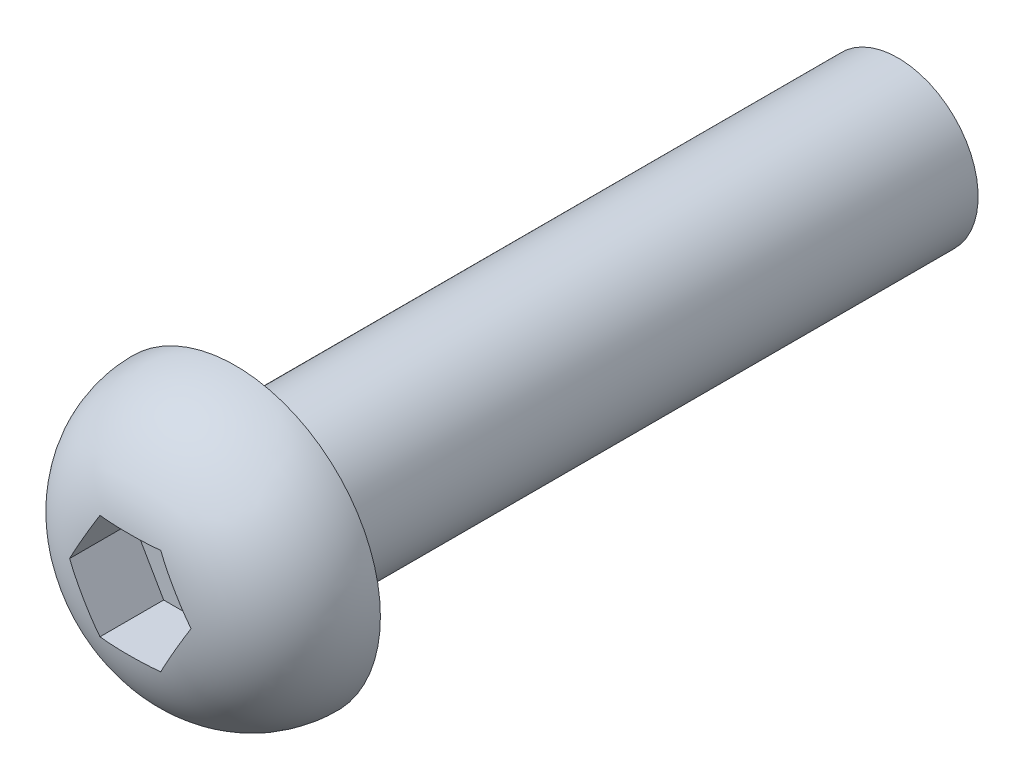
ISO-10303-21;
HEADER;
FILE_DESCRIPTION(('STEP AP214'),'2;1');
FILE_NAME('part.step','',(''),(''),'','','');
FILE_SCHEMA(('AUTOMOTIVE_DESIGN { 1 0 10303 214 1 1 1 1 }'));
ENDSEC;
DATA;
#1=APPLICATION_CONTEXT('core data for automotive mechanical design processes');
#2=APPLICATION_PROTOCOL_DEFINITION('international standard','automotive_design',2000,#1);
#3=PRODUCT_CONTEXT('',#1,'mechanical');
#4=PRODUCT('Part','Part','',(#3));
#5=PRODUCT_RELATED_PRODUCT_CATEGORY('part','',(#4));
#6=PRODUCT_DEFINITION_FORMATION('','',#4);
#7=PRODUCT_DEFINITION_CONTEXT('part definition',#1,'design');
#8=PRODUCT_DEFINITION('design','',#6,#7);
#9=PRODUCT_DEFINITION_SHAPE('','',#8);
#10=(LENGTH_UNIT() NAMED_UNIT(*) SI_UNIT(.MILLI.,.METRE.));
#11=(NAMED_UNIT(*) PLANE_ANGLE_UNIT() SI_UNIT($,.RADIAN.));
#12=(NAMED_UNIT(*) SI_UNIT($,.STERADIAN.) SOLID_ANGLE_UNIT());
#13=UNCERTAINTY_MEASURE_WITH_UNIT(LENGTH_MEASURE(1.E-05),#10,'distance_accuracy_value','');
#14=(GEOMETRIC_REPRESENTATION_CONTEXT(3) GLOBAL_UNCERTAINTY_ASSIGNED_CONTEXT((#13)) GLOBAL_UNIT_ASSIGNED_CONTEXT((#10,
#11,#12)) REPRESENTATION_CONTEXT('',''));
#15=CARTESIAN_POINT('',(0.,0.,0.));
#16=DIRECTION('',(0.,0.,1.));
#17=DIRECTION('',(1.,0.,0.));
#18=AXIS2_PLACEMENT_3D('',#15,#16,#17);
#19=CARTESIAN_POINT('',(0.733234841870826,0.,10.75));
#20=DIRECTION('',(0.866025403784436,-0.5,0.));
#21=DIRECTION('',(0.,0.,-1.));
#22=AXIS2_PLACEMENT_3D('',#19,#20,#21);
#23=PLANE('',#22);
#24=CARTESIAN_POINT('',(0.733234841870825,0.,9.2687702803701));
#25=CARTESIAN_POINT('',(0.722645576231375,-0.0183307043351555,9.2711340555782));
#26=CARTESIAN_POINT('',(0.712038508902785,-0.0366862875780835,9.2732093303891));
#27=CARTESIAN_POINT('',(0.691092285850324,-0.072942876033149,9.27679816884168));
#28=CARTESIAN_POINT('',(0.680753612187266,-0.09084280334097,9.27832536086217));
#29=CARTESIAN_POINT('',(0.660247391859197,-0.126374190104123,9.28093165469778));
#30=CARTESIAN_POINT('',(0.650079862985595,-0.144005155502563,9.28201779600541));
#31=CARTESIAN_POINT('',(0.62980888535465,-0.17911053300842,9.283827515358));
#32=CARTESIAN_POINT('',(0.619705683225457,-0.196584926285561,9.28455426785845));
#33=CARTESIAN_POINT('',(0.599648362600587,-0.231303440309478,9.28568680003494));
#34=CARTESIAN_POINT('',(0.589694137144565,-0.248547359923683,9.28609693084864));
#35=CARTESIAN_POINT('',(0.569810979125249,-0.283032719985925,9.28663735370915));
#36=CARTESIAN_POINT('',(0.559882031663909,-0.300274147890243,9.28676790503828));
#37=CARTESIAN_POINT('',(0.539958564232879,-0.334746038376339,9.28677051664334));
#38=CARTESIAN_POINT('',(0.529963981056425,-0.351976464431464,9.28664227382496));
#39=CARTESIAN_POINT('',(0.510018564390844,-0.386326075202093,9.28611347503351));
#40=CARTESIAN_POINT('',(0.50006781011986,-0.403445329467766,9.28571449038074));
#41=CARTESIAN_POINT('',(0.480142642799556,-0.43780003883835,9.28460958137201));
#42=CARTESIAN_POINT('',(0.470168454936711,-0.455035566483322,9.28390180188867));
#43=CARTESIAN_POINT('',(0.450091567638427,-0.489821291803888,9.28212230276186));
#44=CARTESIAN_POINT('',(0.439989714455516,-0.507371664558289,9.28104436901666));
#45=CARTESIAN_POINT('',(0.419536559560933,-0.542961145873579,9.27844206147772));
#46=CARTESIAN_POINT('',(0.409186301500345,-0.561000010055692,9.2769059017241));
#47=CARTESIAN_POINT('',(0.388101814561607,-0.597708764458351,9.27327967758913));
#48=CARTESIAN_POINT('',(0.377367765385867,-0.616376907656516,9.27117097571238));
#49=CARTESIAN_POINT('',(0.36661742093541,-0.635000000000001,9.2687702803701));
#50=B_SPLINE_CURVE_WITH_KNOTS('',3,(#24,#25,#26,#27,#28,#29,#30,#31,#32,#33,#34,#35,#36,#37,#38,
#39,#40,#41,#42,#43,#44,#45,#46,#47,#48,#49),.UNSPECIFIED.,.F.,.F.,(4,2,2,2,2,2,2,2,2,2,2,2,4),
(0.,0.0638986330519423,0.126075547350486,0.187216877524469,0.247808049171032,0.307550952154507,
0.367238425466743,0.426995844070509,0.486409378221557,0.546184871033716,0.6070173496093,
0.669573757074784,0.73447978042255),.UNSPECIFIED.);
#51=CARTESIAN_POINT('',(0.733234841870826,0.,9.2687702803701));
#52=VERTEX_POINT('',#51);
#53=CARTESIAN_POINT('',(0.366617420935409,-0.635,9.2687702803701));
#54=VERTEX_POINT('',#53);
#55=EDGE_CURVE('E42',#52,#54,#50,.T.);
#56=ORIENTED_EDGE('',*,*,#55,.F.);
#57=DIRECTION('',(0.,0.,-1.));
#58=VECTOR('',#57,1.);
#59=CARTESIAN_POINT('',(0.733234841870826,0.,10.75));
#60=LINE('',#59,#58);
#61=CARTESIAN_POINT('',(0.733234841870826,0.,8.5));
#62=VERTEX_POINT('',#61);
#63=EDGE_CURVE('E10',#52,#62,#60,.T.);
#64=ORIENTED_EDGE('',*,*,#63,.T.);
#65=DIRECTION('',(-0.5,-0.866025403784436,0.));
#66=VECTOR('',#65,1.);
#67=CARTESIAN_POINT('',(0.366617420935409,-0.635,8.5));
#68=LINE('',#67,#66);
#69=CARTESIAN_POINT('',(0.366617420935409,-0.635,8.5));
#70=VERTEX_POINT('',#69);
#71=EDGE_CURVE('E29',#62,#70,#68,.T.);
#72=ORIENTED_EDGE('',*,*,#71,.T.);
#73=DIRECTION('',(0.,0.,-1.));
#74=VECTOR('',#73,1.);
#75=CARTESIAN_POINT('',(0.366617420935409,-0.635,10.75));
#76=LINE('',#75,#74);
#77=EDGE_CURVE('E216',#54,#70,#76,.T.);
#78=ORIENTED_EDGE('',*,*,#77,.F.);
#79=EDGE_LOOP('',(#56,#64,#72,#78));
#80=FACE_BOUND('',#79,.T.);
#81=ADVANCED_FACE('F15',(#80),#23,.F.);
#82=CARTESIAN_POINT('',(0.366617420935409,-0.635,10.75));
#83=DIRECTION('',(0.,-1.,0.));
#84=DIRECTION('',(0.,0.,-1.));
#85=AXIS2_PLACEMENT_3D('',#82,#83,#84);
#86=PLANE('',#85);
#87=CARTESIAN_POINT('',(0.36661742093541,-0.635000000000001,9.2687702803701));
#88=CARTESIAN_POINT('',(0.334577255826742,-0.635000210958001,9.27234348278657));
#89=CARTESIAN_POINT('',(0.302472473170063,-0.634979075442529,9.27526283750982));
#90=CARTESIAN_POINT('',(0.239638856885391,-0.63493668503853,9.27989768389737));
#91=CARTESIAN_POINT('',(0.20891365740447,-0.634915479039326,9.2816617704193));
#92=CARTESIAN_POINT('',(0.148341217012231,-0.634908353044016,9.28433449041025));
#93=CARTESIAN_POINT('',(0.118494958048674,-0.63492140538111,9.28526693896785));
#94=CARTESIAN_POINT('',(0.05909904584637,-0.634967942059237,9.28648088892375));
#95=CARTESIAN_POINT('',(0.0295495234590158,-0.63500121330453,9.2867690346434));
#96=CARTESIAN_POINT('',(-0.0295458029959293,-0.634998786848232,9.28676938548681));
#97=CARTESIAN_POINT('',(-0.0590916070632504,-0.634963097829719,9.28648166312038));
#98=CARTESIAN_POINT('',(-0.118481947878686,-0.634914594855626,9.28526830130765));
#99=CARTESIAN_POINT('',(-0.148326353019931,-0.634902025819057,9.28433597416094));
#100=CARTESIAN_POINT('',(-0.208897928041457,-0.634910916108021,9.28166335252366));
#101=CARTESIAN_POINT('',(-0.23962411263907,-0.634933430413216,9.27989916530908));
#102=CARTESIAN_POINT('',(-0.302463309494095,-0.63497809883531,9.27526385547625));
#103=CARTESIAN_POINT('',(-0.3345726785621,-0.635000184733362,9.27234401675897));
#104=CARTESIAN_POINT('',(-0.366617420935679,-0.635000000000461,9.26877028036997));
#105=B_SPLINE_CURVE_WITH_KNOTS('',3,(#87,#88,#89,#90,#91,#92,#93,#94,#95,#96,#97,#98,#99,#100,
#101,#102,#103,#104),.UNSPECIFIED.,.F.,.F.,(4,2,2,2,2,2,2,2,4),(0.,0.0966978361101668,
0.189010046566814,0.278584984370413,0.367231842413965,0.455867539283832,0.545436897799791,
0.637752078962693,0.73446374360044),.UNSPECIFIED.);
#106=CARTESIAN_POINT('',(-0.366617420935415,-0.635,9.2687702803701));
#107=VERTEX_POINT('',#106);
#108=EDGE_CURVE('E180',#54,#107,#105,.T.);
#109=ORIENTED_EDGE('',*,*,#108,.F.);
#110=ORIENTED_EDGE('',*,*,#77,.T.);
#111=DIRECTION('',(-1.,0.,0.));
#112=VECTOR('',#111,1.);
#113=CARTESIAN_POINT('',(-0.366617420935415,-0.635,8.5));
#114=LINE('',#113,#112);
#115=CARTESIAN_POINT('',(-0.366617420935415,-0.635,8.5));
#116=VERTEX_POINT('',#115);
#117=EDGE_CURVE('E220',#70,#116,#114,.T.);
#118=ORIENTED_EDGE('',*,*,#117,.T.);
#119=DIRECTION('',(0.,0.,-1.));
#120=VECTOR('',#119,1.);
#121=CARTESIAN_POINT('',(-0.366617420935415,-0.635,10.75));
#122=LINE('',#121,#120);
#123=EDGE_CURVE('E185',#107,#116,#122,.T.);
#124=ORIENTED_EDGE('',*,*,#123,.F.);
#125=EDGE_LOOP('',(#109,#110,#118,#124));
#126=FACE_BOUND('',#125,.T.);
#127=ADVANCED_FACE('F187',(#126),#86,.F.);
#128=CARTESIAN_POINT('',(-0.366617420935415,-0.635,10.75));
#129=DIRECTION('',(-0.866025403784439,-0.5,0.));
#130=DIRECTION('',(-0.5,0.866025403784439,0.));
#131=AXIS2_PLACEMENT_3D('',#128,#129,#130);
#132=PLANE('',#131);
#133=CARTESIAN_POINT('',(-0.366617420935679,-0.635000000000461,9.26877028036997));
#134=CARTESIAN_POINT('',(-0.377365953409634,-0.616380017883794,9.27117057241232));
#135=CARTESIAN_POINT('',(-0.388098552382263,-0.597715196660542,9.27327889917635));
#136=CARTESIAN_POINT('',(-0.409181299702985,-0.561011860281275,9.27690461877314));
#137=CARTESIAN_POINT('',(-0.419531255989925,-0.542975081158114,9.27844060979344));
#138=CARTESIAN_POINT('',(-0.43998456403568,-0.507388448771364,9.28104275641307));
#139=CARTESIAN_POINT('',(-0.450086874427321,-0.489838838844386,9.28212066591909));
#140=CARTESIAN_POINT('',(-0.470164940456809,-0.455053222896617,9.28390025609941));
#141=CARTESIAN_POINT('',(-0.480139860092234,-0.437817046425698,9.28460812578013));
#142=CARTESIAN_POINT('',(-0.500066562606967,-0.403459750000068,9.28571329267877));
#143=CARTESIAN_POINT('',(-0.510018125478038,-0.386338559953636,9.28611242700848));
#144=CARTESIAN_POINT('',(-0.52996402228916,-0.351983378619646,9.28664173056802));
#145=CARTESIAN_POINT('',(-0.53995826713932,-0.334749311871366,9.286770317409));
#146=CARTESIAN_POINT('',(-0.559875495261656,-0.300282702936584,9.28676810479851));
#147=CARTESIAN_POINT('',(-0.569798576367953,-0.283050217287615,9.28663778632632));
#148=CARTESIAN_POINT('',(-0.58967746880554,-0.24857465214862,9.28609763090176));
#149=CARTESIAN_POINT('',(-0.599633306804945,-0.231331594294876,9.28568738353709));
#150=CARTESIAN_POINT('',(-0.619696821204178,-0.196604323591637,9.28455472592449));
#151=CARTESIAN_POINT('',(-0.629804574240431,-0.179120299420851,9.28382780696228));
#152=CARTESIAN_POINT('',(-0.650075991279004,-0.144009541125413,9.28201823570465));
#153=CARTESIAN_POINT('',(-0.660239426888558,-0.126382821885383,9.28093269282405));
#154=CARTESIAN_POINT('',(-0.68074222650595,-0.0908561739340835,9.27832711461189));
#155=CARTESIAN_POINT('',(-0.691081606321834,-0.0729567672475492,9.27679991937046));
#156=CARTESIAN_POINT('',(-0.71203223175008,-0.0366960983334369,9.27321057706));
#157=CARTESIAN_POINT('',(-0.722642990329571,-0.0183359253210636,9.27113465861725));
#158=CARTESIAN_POINT('',(-0.73323484187083,0.,9.26877028037009));
#159=B_SPLINE_CURVE_WITH_KNOTS('',3,(#133,#134,#135,#136,#137,#138,#139,#140,#141,#142,#143,
#144,#145,#146,#147,#148,#149,#150,#151,#152,#153,#154,#155,#156,#157,#158),.UNSPECIFIED.,.F.,
.F.,(4,2,2,2,2,2,2,2,2,2,2,2,4),(0.,0.0648951586533256,0.12744566918461,0.188276848038093,
0.248055135043981,0.307474918490561,0.367241283485874,0.426896721812841,0.486639811263567,
0.547262830329677,0.608386917197516,0.670563536851977,0.734479724535615),.UNSPECIFIED.);
#160=CARTESIAN_POINT('',(-0.733234841870827,0.,9.2687702803701));
#161=VERTEX_POINT('',#160);
#162=EDGE_CURVE('E299',#107,#161,#159,.T.);
#163=ORIENTED_EDGE('',*,*,#162,.F.);
#164=ORIENTED_EDGE('',*,*,#123,.T.);
#165=DIRECTION('',(-0.5,0.866025403784439,0.));
#166=VECTOR('',#165,1.);
#167=CARTESIAN_POINT('',(-0.733234841870827,0.,8.5));
#168=LINE('',#167,#166);
#169=CARTESIAN_POINT('',(-0.733234841870827,0.,8.5));
#170=VERTEX_POINT('',#169);
#171=EDGE_CURVE('E243',#116,#170,#168,.T.);
#172=ORIENTED_EDGE('',*,*,#171,.T.);
#173=DIRECTION('',(0.,0.,-1.));
#174=VECTOR('',#173,1.);
#175=CARTESIAN_POINT('',(-0.733234841870827,0.,10.75));
#176=LINE('',#175,#174);
#177=EDGE_CURVE('E276',#161,#170,#176,.T.);
#178=ORIENTED_EDGE('',*,*,#177,.F.);
#179=EDGE_LOOP('',(#163,#164,#172,#178));
#180=FACE_BOUND('',#179,.T.);
#181=ADVANCED_FACE('F197',(#180),#132,.F.);
#182=CARTESIAN_POINT('',(-0.733234841870827,0.,10.75));
#183=DIRECTION('',(-0.866025403784438,0.5,0.));
#184=DIRECTION('',(0.,0.,1.));
#185=AXIS2_PLACEMENT_3D('',#182,#183,#184);
#186=PLANE('',#185);
#187=CARTESIAN_POINT('',(-0.73323484187083,0.,9.26877028037009));
#188=CARTESIAN_POINT('',(-0.722645576231153,0.0183307043356416,9.27113405557825));
#189=CARTESIAN_POINT('',(-0.712038508902219,0.0366862875789877,9.27320933038921));
#190=CARTESIAN_POINT('',(-0.691092285849345,0.0729428760344218,9.27679816884185));
#191=CARTESIAN_POINT('',(-0.680753612186219,0.0908428033421924,9.27832536086233));
#192=CARTESIAN_POINT('',(-0.660247391858479,0.12637419010492,9.28093165469788));
#193=CARTESIAN_POINT('',(-0.650079862985274,0.144005155502983,9.28201779600544));
#194=CARTESIAN_POINT('',(-0.629808885353737,0.179110533010141,9.28382751535807));
#195=CARTESIAN_POINT('',(-0.619705683223554,0.196584926288962,9.28455426785858));
#196=CARTESIAN_POINT('',(-0.599648362597405,0.231303440314392,9.28568680003512));
#197=CARTESIAN_POINT('',(-0.589694137141098,0.24854735992843,9.28609693084884));
#198=CARTESIAN_POINT('',(-0.569810979122706,0.283032719988955,9.28663735370927));
#199=CARTESIAN_POINT('',(-0.559882031662575,0.30027414789172,9.28676790503834));
#200=CARTESIAN_POINT('',(-0.539958564232831,0.334746038377253,9.28677051664328));
#201=CARTESIAN_POINT('',(-0.529963981056447,0.351976464433363,9.28664227382482));
#202=CARTESIAN_POINT('',(-0.510018564390718,0.386326075205508,9.28611347503323));
#203=CARTESIAN_POINT('',(-0.500067810119518,0.403445329471715,9.28571449038041));
#204=CARTESIAN_POINT('',(-0.480142642798799,0.43780003884301,9.28460958137161));
#205=CARTESIAN_POINT('',(-0.470168454935752,0.45503556648816,9.28390180188825));
#206=CARTESIAN_POINT('',(-0.450091567637143,0.489821291808695,9.28212230276141));
#207=CARTESIAN_POINT('',(-0.439989714454108,0.507371664562888,9.28104436901622));
#208=CARTESIAN_POINT('',(-0.419536559559483,0.542961145877397,9.27844206147732));
#209=CARTESIAN_POINT('',(-0.409186301498978,0.561000010058939,9.27690590172374));
#210=CARTESIAN_POINT('',(-0.388101814560716,0.597708764460112,9.27327967758892));
#211=CARTESIAN_POINT('',(-0.377367765385373,0.616376907657366,9.27117097571227));
#212=CARTESIAN_POINT('',(-0.366617420935413,0.634999999999999,9.2687702803701));
#213=B_SPLINE_CURVE_WITH_KNOTS('',3,(#187,#188,#189,#190,#191,#192,#193,#194,#195,#196,#197,
#198,#199,#200,#201,#202,#203,#204,#205,#206,#207,#208,#209,#210,#211,#212),.UNSPECIFIED.,.F.,
.F.,(4,2,2,2,2,2,2,2,2,2,2,2,4),(0.,0.0638986330535524,0.12607554735207,0.18721687752447,
0.247808049176885,0.307550952160356,0.367238425466746,0.426995844072964,0.486409378225724,
0.546184871038649,0.607017349613877,0.669573757077743,0.734479780422532),.UNSPECIFIED.);
#214=CARTESIAN_POINT('',(-0.366617420935413,0.635,9.2687702803701));
#215=VERTEX_POINT('',#214);
#216=EDGE_CURVE('E115',#161,#215,#213,.T.);
#217=ORIENTED_EDGE('',*,*,#216,.F.);
#218=ORIENTED_EDGE('',*,*,#177,.T.);
#219=DIRECTION('',(0.5,0.866025403784438,0.));
#220=VECTOR('',#219,1.);
#221=CARTESIAN_POINT('',(-0.366617420935413,0.635,8.5));
#222=LINE('',#221,#220);
#223=CARTESIAN_POINT('',(-0.366617420935413,0.635,8.5));
#224=VERTEX_POINT('',#223);
#225=EDGE_CURVE('E108',#170,#224,#222,.T.);
#226=ORIENTED_EDGE('',*,*,#225,.T.);
#227=DIRECTION('',(0.,0.,-1.));
#228=VECTOR('',#227,1.);
#229=CARTESIAN_POINT('',(-0.366617420935413,0.635,10.75));
#230=LINE('',#229,#228);
#231=EDGE_CURVE('E250',#215,#224,#230,.T.);
#232=ORIENTED_EDGE('',*,*,#231,.F.);
#233=EDGE_LOOP('',(#217,#218,#226,#232));
#234=FACE_BOUND('',#233,.T.);
#235=ADVANCED_FACE('F17',(#234),#186,.F.);
#236=CARTESIAN_POINT('',(0.366617420935414,0.635,10.75));
#237=DIRECTION('',(0.866025403784438,0.5,0.));
#238=DIRECTION('',(0.,0.,-1.));
#239=AXIS2_PLACEMENT_3D('',#236,#237,#238);
#240=PLANE('',#239);
#241=CARTESIAN_POINT('',(0.366617420935414,0.634999999999999,9.2687702803701));
#242=CARTESIAN_POINT('',(0.377365953409191,0.616380017883633,9.27117057241239));
#243=CARTESIAN_POINT('',(0.388098552381681,0.597715196660704,9.27327889917638));
#244=CARTESIAN_POINT('',(0.409181299702237,0.561011860281976,9.27690461877311));
#245=CARTESIAN_POINT('',(0.41953125598915,0.54297508115903,9.27844060979339));
#246=CARTESIAN_POINT('',(0.439984564034927,0.507388448772593,9.28104275641299));
#247=CARTESIAN_POINT('',(0.450086874426619,0.489838838845712,9.28212066591901));
#248=CARTESIAN_POINT('',(0.470164940456243,0.45505322289801,9.28390025609933));
#249=CARTESIAN_POINT('',(0.480139860091754,0.437817046427062,9.28460812578004));
#250=CARTESIAN_POINT('',(0.50006656260667,0.403459750001251,9.28571329267869));
#251=CARTESIAN_POINT('',(0.510018125477839,0.386338559954668,9.28611242700842));
#252=CARTESIAN_POINT('',(0.52996402228909,0.351983378620231,9.28664173056799));
#253=CARTESIAN_POINT('',(0.539958267139283,0.334749311871656,9.28677031740899));
#254=CARTESIAN_POINT('',(0.559875495261476,0.300282702936671,9.28676810479853));
#255=CARTESIAN_POINT('',(0.5697985763676,0.283050217287794,9.28663778632636));
#256=CARTESIAN_POINT('',(0.589677468805036,0.248574652148911,9.28609763090181));
#257=CARTESIAN_POINT('',(0.599633306804461,0.231331594295185,9.28568738353714));
#258=CARTESIAN_POINT('',(0.619696821203875,0.19660432359186,9.28455472592452));
#259=CARTESIAN_POINT('',(0.62980457424029,0.17912029942097,9.28382780696229));
#260=CARTESIAN_POINT('',(0.650075991279166,0.14400954112526,9.28201823570463));
#261=CARTESIAN_POINT('',(0.66023942688886,0.126382821885063,9.28093269282402));
#262=CARTESIAN_POINT('',(0.680742226506369,0.0908561739335794,9.27832711461183));
#263=CARTESIAN_POINT('',(0.691081606322228,0.0729567672470269,9.2767999193704));
#264=CARTESIAN_POINT('',(0.712032231750313,0.0366960983330708,9.27321057705995));
#265=CARTESIAN_POINT('',(0.722642990329668,0.0183359253208714,9.27113465861722));
#266=CARTESIAN_POINT('',(0.733234841870825,0.,9.26877028037009));
#267=B_SPLINE_CURVE_WITH_KNOTS('',3,(#241,#242,#243,#244,#245,#246,#247,#248,#249,#250,#251,
#252,#253,#254,#255,#256,#257,#258,#259,#260,#261,#262,#263,#264,#265,#266),.UNSPECIFIED.,.F.,
.F.,(4,2,2,2,2,2,2,2,2,2,2,2,4),(0.,0.0648951586522691,0.12744566918295,0.188276848036255,
0.248055135042349,0.30747491848947,0.367241283485595,0.426896721812064,0.486639811262772,
0.547262830329398,0.608386917197883,0.670563536852354,0.734479724535334),.UNSPECIFIED.);
#268=CARTESIAN_POINT('',(0.366617420935414,0.635,9.2687702803701));
#269=VERTEX_POINT('',#268);
#270=EDGE_CURVE('E86',#269,#52,#267,.T.);
#271=ORIENTED_EDGE('',*,*,#270,.F.);
#272=DIRECTION('',(0.,0.,-1.));
#273=VECTOR('',#272,1.);
#274=CARTESIAN_POINT('',(0.366617420935414,0.635,10.75));
#275=LINE('',#274,#273);
#276=CARTESIAN_POINT('',(0.366617420935414,0.635,8.5));
#277=VERTEX_POINT('',#276);
#278=EDGE_CURVE('E91',#269,#277,#275,.T.);
#279=ORIENTED_EDGE('',*,*,#278,.T.);
#280=DIRECTION('',(0.5,-0.866025403784438,0.));
#281=VECTOR('',#280,1.);
#282=CARTESIAN_POINT('',(0.733234841870826,0.,8.5));
#283=LINE('',#282,#281);
#284=EDGE_CURVE('E109',#277,#62,#283,.T.);
#285=ORIENTED_EDGE('',*,*,#284,.T.);
#286=ORIENTED_EDGE('',*,*,#63,.F.);
#287=EDGE_LOOP('',(#271,#279,#285,#286));
#288=FACE_BOUND('',#287,.T.);
#289=ADVANCED_FACE('F89',(#288),#240,.F.);
#290=CARTESIAN_POINT('',(-0.366617420935413,0.635,10.75));
#291=DIRECTION('',(0.,1.,0.));
#292=DIRECTION('',(1.,0.,0.));
#293=AXIS2_PLACEMENT_3D('',#290,#291,#292);
#294=PLANE('',#293);
#295=CARTESIAN_POINT('',(-0.366617420935413,0.634999999999999,9.2687702803701));
#296=CARTESIAN_POINT('',(-0.334577255827058,0.635000210958001,9.27234348278653));
#297=CARTESIAN_POINT('',(-0.302472473170694,0.634979075442595,9.27526283750975));
#298=CARTESIAN_POINT('',(-0.239638856886404,0.634936685038754,9.27989768389727));
#299=CARTESIAN_POINT('',(-0.20891365740555,0.63491547903964,9.28166177041919));
#300=CARTESIAN_POINT('',(-0.148341217013252,0.63490835304445,9.28433449041014));
#301=CARTESIAN_POINT('',(-0.118494958049567,0.634921405381575,9.28526693896776));
#302=CARTESIAN_POINT('',(-0.0590990458468807,0.634967942059571,9.2864808889237));
#303=CARTESIAN_POINT('',(-0.0295495234592713,0.635001213304704,9.28676903464338));
#304=CARTESIAN_POINT('',(0.0295458029957541,0.634998786848058,9.28676938548683));
#305=CARTESIAN_POINT('',(0.0590916070629002,0.634963097829359,9.28648166312043));
#306=CARTESIAN_POINT('',(0.118481947878055,0.634914594855054,9.28526830130775));
#307=CARTESIAN_POINT('',(0.148326353019194,0.63490202581846,9.28433597416105));
#308=CARTESIAN_POINT('',(0.20889792804063,0.634910916107426,9.2816633525238));
#309=CARTESIAN_POINT('',(0.239624112638257,0.634933430412652,9.27989916530923));
#310=CARTESIAN_POINT('',(0.302463309493474,0.634978098834809,9.27526385547639));
#311=CARTESIAN_POINT('',(0.334572678561656,0.635000184732896,9.2723440167591));
#312=CARTESIAN_POINT('',(0.366617420935414,0.634999999999999,9.2687702803701));
#313=B_SPLINE_CURVE_WITH_KNOTS('',3,(#295,#296,#297,#298,#299,#300,#301,#302,#303,#304,#305,
#306,#307,#308,#309,#310,#311,#312),.UNSPECIFIED.,.F.,.F.,(4,2,2,2,2,2,2,2,4),(0.,
0.0966978361092194,0.189010046565663,0.278584984369646,0.367231842413964,0.455867539283306,
0.545436897798945,0.637752078961891,0.734463743600171),.UNSPECIFIED.);
#314=EDGE_CURVE('E97',#215,#269,#313,.T.);
#315=ORIENTED_EDGE('',*,*,#314,.F.);
#316=ORIENTED_EDGE('',*,*,#231,.T.);
#317=DIRECTION('',(1.,0.,0.));
#318=VECTOR('',#317,1.);
#319=CARTESIAN_POINT('',(0.366617420935414,0.635,8.5));
#320=LINE('',#319,#318);
#321=EDGE_CURVE('E106',#224,#277,#320,.T.);
#322=ORIENTED_EDGE('',*,*,#321,.T.);
#323=ORIENTED_EDGE('',*,*,#278,.F.);
#324=EDGE_LOOP('',(#315,#316,#322,#323));
#325=FACE_BOUND('',#324,.T.);
#326=ADVANCED_FACE('F102',(#325),#294,.F.);
#327=CARTESIAN_POINT('',(0.,0.,8.5));
#328=DIRECTION('',(0.,0.,-1.));
#329=DIRECTION('',(0.,-1.,0.));
#330=AXIS2_PLACEMENT_3D('',#327,#328,#329);
#331=PLANE('',#330);
#332=ORIENTED_EDGE('',*,*,#321,.F.);
#333=ORIENTED_EDGE('',*,*,#225,.F.);
#334=ORIENTED_EDGE('',*,*,#171,.F.);
#335=ORIENTED_EDGE('',*,*,#117,.F.);
#336=ORIENTED_EDGE('',*,*,#71,.F.);
#337=ORIENTED_EDGE('',*,*,#284,.F.);
#338=EDGE_LOOP('',(#332,#333,#334,#335,#336,#337));
#339=FACE_BOUND('',#338,.T.);
#340=ADVANCED_FACE('F139',(#339),#331,.F.);
#341=CARTESIAN_POINT('',(-1.75,0.,8.));
#342=CARTESIAN_POINT('',(-1.75,-1.75,7.99999999999999));
#343=CARTESIAN_POINT('',(0.,-1.75,8.));
#344=CARTESIAN_POINT('',(1.75,-1.75,7.99999999999999));
#345=CARTESIAN_POINT('',(1.75,0.,8.));
#346=CARTESIAN_POINT('',(1.75,1.75,7.99999999999999));
#347=CARTESIAN_POINT('',(0.,1.75,8.));
#348=CARTESIAN_POINT('',(-1.75,1.75,7.99999999999999));
#349=CARTESIAN_POINT('',(-1.75,0.,8.));
#350=CARTESIAN_POINT('',(-1.75,0.,9.12646462834949));
#351=CARTESIAN_POINT('',(-1.75,-1.75,9.12646462834949));
#352=CARTESIAN_POINT('',(0.,-1.75,9.12646462834949));
#353=CARTESIAN_POINT('',(1.75,-1.75,9.12646462834949));
#354=CARTESIAN_POINT('',(1.75,0.,9.12646462834949));
#355=CARTESIAN_POINT('',(1.75,1.75,9.12646462834949));
#356=CARTESIAN_POINT('',(0.,1.75,9.12646462834949));
#357=CARTESIAN_POINT('',(-1.75,1.75,9.12646462834949));
#358=CARTESIAN_POINT('',(-1.75,0.,9.12646462834949));
#359=CARTESIAN_POINT('',(-0.635,0.,9.28676921007615));
#360=CARTESIAN_POINT('',(-0.634999999999999,-0.634999999999999,9.28676921007615));
#361=CARTESIAN_POINT('',(0.,-0.635,9.28676921007615));
#362=CARTESIAN_POINT('',(0.634999999999999,-0.634999999999999,9.28676921007615));
#363=CARTESIAN_POINT('',(0.635,0.,9.28676921007615));
#364=CARTESIAN_POINT('',(0.634999999999999,0.634999999999999,9.28676921007615));
#365=CARTESIAN_POINT('',(0.,0.635,9.28676921007615));
#366=CARTESIAN_POINT('',(-0.634999999999999,0.634999999999999,9.28676921007615));
#367=CARTESIAN_POINT('',(-0.635,0.,9.28676921007615));
#368=(BOUNDED_SURFACE() B_SPLINE_SURFACE(2,2,((#341,#342,#343,#344,#345,#346,#347,#348,#349),
(#350,#351,#352,#353,#354,#355,#356,#357,#358),(#359,#360,#361,#362,#363,#364,#365,#366,#367)),
.UNSPECIFIED.,.F.,.T.,.F.) B_SPLINE_SURFACE_WITH_KNOTS((3,3),(3,2,2,2,3),(0.,1.42800388016806),
(-3.14159265358979,-1.5707963267949,0.,1.5707963267949,3.14159265358979),
.UNSPECIFIED.) GEOMETRIC_REPRESENTATION_ITEM() RATIONAL_B_SPLINE_SURFACE(((1.,0.707106781186548,
1.,0.707106781186548,1.,0.707106781186548,1.,0.707106781186548,1.),(0.755747210483668,
0.534393977395819,0.755747210483668,0.534393977395819,0.755747210483668,0.534393977395819,
0.755747210483668,0.534393977395819,0.755747210483668),(1.,0.707106781186548,1.,
0.707106781186548,1.,0.707106781186548,1.,0.707106781186548,1.))) REPRESENTATION_ITEM('') SURFACE());
#369=CARTESIAN_POINT('',(-0.733234841870828,0.,9.2687702803701));
#370=CARTESIAN_POINT('',(-1.75,0.,9.04179198237711));
#371=CARTESIAN_POINT('',(-1.75,0.,8.));
#372=(BOUNDED_CURVE() B_SPLINE_CURVE(2,(#369,#370,#371),.UNSPECIFIED.,.F.,
.F.) B_SPLINE_CURVE_WITH_KNOTS((3,3),(-1.34536600835073,0.),
.UNSPECIFIED.) CURVE() GEOMETRIC_REPRESENTATION_ITEM() RATIONAL_B_SPLINE_CURVE((0.973366372098588,
0.769881997504485,1.)) REPRESENTATION_ITEM(''));
#373=CARTESIAN_POINT('',(-1.75,0.,8.));
#374=VERTEX_POINT('',#373);
#375=EDGE_CURVE('E295',#161,#374,#372,.T.);
#376=CARTESIAN_POINT('',(0.,0.,8.));
#377=DIRECTION('',(0.,0.,1.));
#378=DIRECTION('',(-1.,0.,0.));
#379=AXIS2_PLACEMENT_3D('',#376,#377,#378);
#380=CIRCLE('',#379,1.75);
#381=CARTESIAN_POINT('',(1.75,0.,8.));
#382=VERTEX_POINT('',#381);
#383=EDGE_CURVE('E273',#374,#382,#380,.T.);
#384=CARTESIAN_POINT('',(0.,0.,8.));
#385=DIRECTION('',(0.,0.,1.));
#386=DIRECTION('',(-1.,0.,0.));
#387=AXIS2_PLACEMENT_3D('',#384,#385,#386);
#388=CIRCLE('',#387,1.75);
#389=EDGE_CURVE('E267',#382,#374,#388,.T.);
#390=ORIENTED_EDGE('',*,*,#216,.T.);
#391=ORIENTED_EDGE('',*,*,#314,.T.);
#392=ORIENTED_EDGE('',*,*,#270,.T.);
#393=ORIENTED_EDGE('',*,*,#55,.T.);
#394=ORIENTED_EDGE('',*,*,#108,.T.);
#395=ORIENTED_EDGE('',*,*,#162,.T.);
#396=ORIENTED_EDGE('',*,*,#375,.T.);
#397=ORIENTED_EDGE('',*,*,#383,.T.);
#398=ORIENTED_EDGE('',*,*,#389,.T.);
#399=ORIENTED_EDGE('',*,*,#375,.F.);
#400=EDGE_LOOP('',(#390,#391,#392,#393,#394,#395,#396,#397,#398,#399));
#401=FACE_BOUND('',#400,.T.);
#402=ADVANCED_FACE('F112',(#401),#368,.F.);
#403=CARTESIAN_POINT('',(0.,0.,8.));
#404=DIRECTION('',(0.,0.,1.));
#405=DIRECTION('',(1.,0.,0.));
#406=AXIS2_PLACEMENT_3D('',#403,#404,#405);
#407=PLANE('',#406);
#408=ORIENTED_EDGE('',*,*,#389,.F.);
#409=ORIENTED_EDGE('',*,*,#383,.F.);
#410=EDGE_LOOP('',(#408,#409));
#411=FACE_BOUND('',#410,.T.);
#412=CARTESIAN_POINT('',(0.,0.,8.));
#413=DIRECTION('',(0.,0.,1.));
#414=DIRECTION('',(1.,0.,0.));
#415=AXIS2_PLACEMENT_3D('',#412,#413,#414);
#416=CIRCLE('',#415,0.96675);
#417=CARTESIAN_POINT('',(-0.96675,0.,8.));
#418=VERTEX_POINT('',#417);
#419=EDGE_CURVE('E246',#418,#418,#416,.T.);
#420=ORIENTED_EDGE('',*,*,#419,.T.);
#421=EDGE_LOOP('',(#420));
#422=FACE_BOUND('',#421,.T.);
#423=ADVANCED_FACE('F138',(#411,#422),#407,.F.);
#424=CARTESIAN_POINT('',(0.,0.,0.));
#425=DIRECTION('',(0.,0.,1.));
#426=DIRECTION('',(1.,0.,0.));
#427=AXIS2_PLACEMENT_3D('',#424,#425,#426);
#428=CYLINDRICAL_SURFACE('',#427,0.96675);
#429=ORIENTED_EDGE('',*,*,#419,.F.);
#430=DIRECTION('',(0.,0.,-1.));
#431=VECTOR('',#430,1.);
#432=CARTESIAN_POINT('',(-0.96675,0.,0.));
#433=LINE('',#432,#431);
#434=CARTESIAN_POINT('',(-0.96675,0.,0.));
#435=VERTEX_POINT('',#434);
#436=EDGE_CURVE('E254',#418,#435,#433,.T.);
#437=ORIENTED_EDGE('',*,*,#436,.T.);
#438=CARTESIAN_POINT('',(0.,0.,0.));
#439=DIRECTION('',(0.,0.,1.));
#440=DIRECTION('',(1.,0.,0.));
#441=AXIS2_PLACEMENT_3D('',#438,#439,#440);
#442=CIRCLE('',#441,0.96675);
#443=EDGE_CURVE('E251',#435,#435,#442,.T.);
#444=ORIENTED_EDGE('',*,*,#443,.T.);
#445=ORIENTED_EDGE('',*,*,#436,.F.);
#446=EDGE_LOOP('',(#429,#437,#444,#445));
#447=FACE_BOUND('',#446,.T.);
#448=ADVANCED_FACE('F141',(#447),#428,.T.);
#449=CARTESIAN_POINT('',(0.,0.,0.));
#450=DIRECTION('',(0.,0.,1.));
#451=DIRECTION('',(1.,0.,0.));
#452=AXIS2_PLACEMENT_3D('',#449,#450,#451);
#453=PLANE('',#452);
#454=ORIENTED_EDGE('',*,*,#443,.F.);
#455=EDGE_LOOP('',(#454));
#456=FACE_BOUND('',#455,.T.);
#457=ADVANCED_FACE('F327',(#456),#453,.F.);
#458=CLOSED_SHELL('',(#81,#127,#181,#235,#289,#326,#340,#402,#423,#448,#457));
#459=MANIFOLD_SOLID_BREP('B1',#458);
#460=ADVANCED_BREP_SHAPE_REPRESENTATION('',(#18,#459),#14);
#461=SHAPE_DEFINITION_REPRESENTATION(#9,#460);
ENDSEC;
END-ISO-10303-21;
